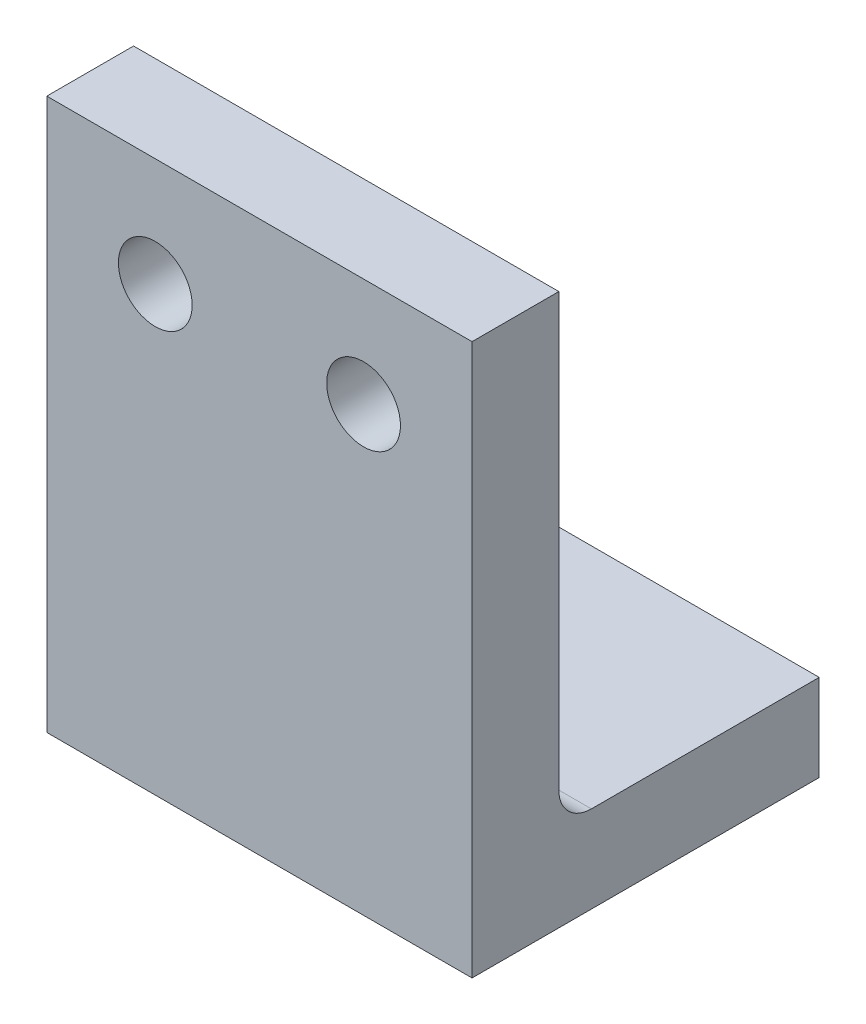
ISO-10303-21;
HEADER;
FILE_DESCRIPTION(('STEP AP214'),'2;1');
FILE_NAME('part.step','',(''),(''),'','','');
FILE_SCHEMA(('AUTOMOTIVE_DESIGN { 1 0 10303 214 1 1 1 1 }'));
ENDSEC;
DATA;
#1=APPLICATION_CONTEXT('core data for automotive mechanical design processes');
#2=APPLICATION_PROTOCOL_DEFINITION('international standard','automotive_design',2000,#1);
#3=PRODUCT_CONTEXT('',#1,'mechanical');
#4=PRODUCT('Part','Part','',(#3));
#5=PRODUCT_RELATED_PRODUCT_CATEGORY('part','',(#4));
#6=PRODUCT_DEFINITION_FORMATION('','',#4);
#7=PRODUCT_DEFINITION_CONTEXT('part definition',#1,'design');
#8=PRODUCT_DEFINITION('design','',#6,#7);
#9=PRODUCT_DEFINITION_SHAPE('','',#8);
#10=(LENGTH_UNIT() NAMED_UNIT(*) SI_UNIT(.MILLI.,.METRE.));
#11=(NAMED_UNIT(*) PLANE_ANGLE_UNIT() SI_UNIT($,.RADIAN.));
#12=(NAMED_UNIT(*) SI_UNIT($,.STERADIAN.) SOLID_ANGLE_UNIT());
#13=UNCERTAINTY_MEASURE_WITH_UNIT(LENGTH_MEASURE(1.E-05),#10,'distance_accuracy_value','');
#14=(GEOMETRIC_REPRESENTATION_CONTEXT(3) GLOBAL_UNCERTAINTY_ASSIGNED_CONTEXT((#13)) GLOBAL_UNIT_ASSIGNED_CONTEXT((#10,
#11,#12)) REPRESENTATION_CONTEXT('',''));
#15=CARTESIAN_POINT('',(0.,0.,0.));
#16=DIRECTION('',(0.,0.,1.));
#17=DIRECTION('',(1.,0.,0.));
#18=AXIS2_PLACEMENT_3D('',#15,#16,#17);
#19=CARTESIAN_POINT('',(0.,0.,4.));
#20=DIRECTION('',(0.,0.,1.));
#21=DIRECTION('',(1.,0.,0.));
#22=AXIS2_PLACEMENT_3D('',#19,#20,#21);
#23=PLANE('',#22);
#24=CARTESIAN_POINT('',(-4.8,0.,4.));
#25=DIRECTION('',(0.,0.,1.));
#26=DIRECTION('',(1.,0.,0.));
#27=AXIS2_PLACEMENT_3D('',#24,#25,#26);
#28=CIRCLE('',#27,1.7);
#29=CARTESIAN_POINT('',(-3.1,0.,4.));
#30=VERTEX_POINT('',#29);
#31=EDGE_CURVE('E128',#30,#30,#28,.T.);
#32=ORIENTED_EDGE('',*,*,#31,.F.);
#33=EDGE_LOOP('',(#32));
#34=FACE_BOUND('',#33,.T.);
#35=DIRECTION('',(0.,-1.,0.));
#36=VECTOR('',#35,1.);
#37=CARTESIAN_POINT('',(-9.8,5.,4.));
#38=LINE('',#37,#36);
#39=CARTESIAN_POINT('',(-9.8,5.,4.));
#40=VERTEX_POINT('',#39);
#41=CARTESIAN_POINT('',(-9.8,-20.4,4.));
#42=VERTEX_POINT('',#41);
#43=EDGE_CURVE('E134',#40,#42,#38,.T.);
#44=ORIENTED_EDGE('',*,*,#43,.T.);
#45=DIRECTION('',(-1.,0.,0.));
#46=VECTOR('',#45,1.);
#47=CARTESIAN_POINT('',(-9.8,-20.4,4.));
#48=LINE('',#47,#46);
#49=CARTESIAN_POINT('',(9.8,-20.4,4.));
#50=VERTEX_POINT('',#49);
#51=EDGE_CURVE('E108',#50,#42,#48,.T.);
#52=ORIENTED_EDGE('',*,*,#51,.F.);
#53=DIRECTION('',(0.,1.,0.));
#54=VECTOR('',#53,1.);
#55=CARTESIAN_POINT('',(9.8,5.,4.));
#56=LINE('',#55,#54);
#57=CARTESIAN_POINT('',(9.8,5.,4.));
#58=VERTEX_POINT('',#57);
#59=EDGE_CURVE('E136',#50,#58,#56,.T.);
#60=ORIENTED_EDGE('',*,*,#59,.T.);
#61=DIRECTION('',(-1.,0.,0.));
#62=VECTOR('',#61,1.);
#63=CARTESIAN_POINT('',(-9.8,5.,4.));
#64=LINE('',#63,#62);
#65=EDGE_CURVE('E139',#58,#40,#64,.T.);
#66=ORIENTED_EDGE('',*,*,#65,.T.);
#67=EDGE_LOOP('',(#44,#52,#60,#66));
#68=FACE_BOUND('',#67,.T.);
#69=CARTESIAN_POINT('',(4.8,0.,4.));
#70=DIRECTION('',(0.,0.,1.));
#71=DIRECTION('',(1.,0.,0.));
#72=AXIS2_PLACEMENT_3D('',#69,#70,#71);
#73=CIRCLE('',#72,1.7);
#74=CARTESIAN_POINT('',(6.5,0.,4.));
#75=VERTEX_POINT('',#74);
#76=EDGE_CURVE('E120',#75,#75,#73,.T.);
#77=ORIENTED_EDGE('',*,*,#76,.F.);
#78=EDGE_LOOP('',(#77));
#79=FACE_BOUND('',#78,.T.);
#80=ADVANCED_FACE('F33',(#34,#68,#79),#23,.T.);
#81=CARTESIAN_POINT('',(0.,0.,0.));
#82=DIRECTION('',(0.,0.,1.));
#83=DIRECTION('',(1.,0.,0.));
#84=AXIS2_PLACEMENT_3D('',#81,#82,#83);
#85=PLANE('',#84);
#86=DIRECTION('',(0.,1.,0.));
#87=VECTOR('',#86,1.);
#88=CARTESIAN_POINT('',(9.8,5.,0.));
#89=LINE('',#88,#87);
#90=CARTESIAN_POINT('',(9.8,-14.9,0.));
#91=VERTEX_POINT('',#90);
#92=CARTESIAN_POINT('',(9.8,5.,0.));
#93=VERTEX_POINT('',#92);
#94=EDGE_CURVE('E143',#91,#93,#89,.T.);
#95=ORIENTED_EDGE('',*,*,#94,.F.);
#96=DIRECTION('',(1.,0.,0.));
#97=VECTOR('',#96,1.);
#98=CARTESIAN_POINT('',(-9.8,-14.9,0.));
#99=LINE('',#98,#97);
#100=CARTESIAN_POINT('',(-9.8,-14.9,0.));
#101=VERTEX_POINT('',#100);
#102=EDGE_CURVE('E54',#91,#101,#99,.F.);
#103=ORIENTED_EDGE('',*,*,#102,.T.);
#104=DIRECTION('',(0.,-1.,0.));
#105=VECTOR('',#104,1.);
#106=CARTESIAN_POINT('',(-9.8,5.,0.));
#107=LINE('',#106,#105);
#108=CARTESIAN_POINT('',(-9.8,5.,0.));
#109=VERTEX_POINT('',#108);
#110=EDGE_CURVE('E131',#109,#101,#107,.T.);
#111=ORIENTED_EDGE('',*,*,#110,.F.);
#112=DIRECTION('',(-1.,0.,0.));
#113=VECTOR('',#112,1.);
#114=CARTESIAN_POINT('',(-9.8,5.,0.));
#115=LINE('',#114,#113);
#116=EDGE_CURVE('E137',#93,#109,#115,.T.);
#117=ORIENTED_EDGE('',*,*,#116,.F.);
#118=EDGE_LOOP('',(#95,#103,#111,#117));
#119=FACE_BOUND('',#118,.T.);
#120=CARTESIAN_POINT('',(-4.8,0.,0.));
#121=DIRECTION('',(0.,0.,1.));
#122=DIRECTION('',(1.,0.,0.));
#123=AXIS2_PLACEMENT_3D('',#120,#121,#122);
#124=CIRCLE('',#123,1.7);
#125=CARTESIAN_POINT('',(-3.1,0.,0.));
#126=VERTEX_POINT('',#125);
#127=EDGE_CURVE('E126',#126,#126,#124,.T.);
#128=ORIENTED_EDGE('',*,*,#127,.T.);
#129=EDGE_LOOP('',(#128));
#130=FACE_BOUND('',#129,.T.);
#131=CARTESIAN_POINT('',(4.8,0.,0.));
#132=DIRECTION('',(0.,0.,1.));
#133=DIRECTION('',(1.,0.,0.));
#134=AXIS2_PLACEMENT_3D('',#131,#132,#133);
#135=CIRCLE('',#134,1.7);
#136=CARTESIAN_POINT('',(6.5,0.,0.));
#137=VERTEX_POINT('',#136);
#138=EDGE_CURVE('E117',#137,#137,#135,.T.);
#139=ORIENTED_EDGE('',*,*,#138,.T.);
#140=EDGE_LOOP('',(#139));
#141=FACE_BOUND('',#140,.T.);
#142=ADVANCED_FACE('F173',(#119,#130,#141),#85,.F.);
#143=CARTESIAN_POINT('',(-9.8,5.,4.));
#144=DIRECTION('',(1.,0.,0.));
#145=DIRECTION('',(0.,1.,0.));
#146=AXIS2_PLACEMENT_3D('',#143,#144,#145);
#147=PLANE('',#146);
#148=ORIENTED_EDGE('',*,*,#110,.T.);
#149=CARTESIAN_POINT('',(-9.8,-14.9,-1.5));
#150=DIRECTION('',(1.,0.,0.));
#151=DIRECTION('',(0.,1.,0.));
#152=AXIS2_PLACEMENT_3D('',#149,#150,#151);
#153=CIRCLE('',#152,1.5);
#154=CARTESIAN_POINT('',(-9.8,-16.4,-1.5));
#155=VERTEX_POINT('',#154);
#156=EDGE_CURVE('E11',#101,#155,#153,.T.);
#157=ORIENTED_EDGE('',*,*,#156,.T.);
#158=DIRECTION('',(0.,0.,-1.));
#159=VECTOR('',#158,1.);
#160=CARTESIAN_POINT('',(-9.8,-16.4,4.));
#161=LINE('',#160,#159);
#162=CARTESIAN_POINT('',(-9.8,-16.4,-12.));
#163=VERTEX_POINT('',#162);
#164=EDGE_CURVE('E115',#155,#163,#161,.T.);
#165=ORIENTED_EDGE('',*,*,#164,.T.);
#166=DIRECTION('',(0.,1.,0.));
#167=VECTOR('',#166,1.);
#168=CARTESIAN_POINT('',(-9.8,-20.4,-12.));
#169=LINE('',#168,#167);
#170=CARTESIAN_POINT('',(-9.8,-20.4,-12.));
#171=VERTEX_POINT('',#170);
#172=EDGE_CURVE('E95',#171,#163,#169,.T.);
#173=ORIENTED_EDGE('',*,*,#172,.F.);
#174=DIRECTION('',(0.,0.,-1.));
#175=VECTOR('',#174,1.);
#176=CARTESIAN_POINT('',(-9.8,-20.4,4.));
#177=LINE('',#176,#175);
#178=EDGE_CURVE('E102',#42,#171,#177,.T.);
#179=ORIENTED_EDGE('',*,*,#178,.F.);
#180=ORIENTED_EDGE('',*,*,#43,.F.);
#181=DIRECTION('',(0.,0.,-1.));
#182=VECTOR('',#181,1.);
#183=CARTESIAN_POINT('',(-9.8,5.,4.));
#184=LINE('',#183,#182);
#185=EDGE_CURVE('E141',#40,#109,#184,.T.);
#186=ORIENTED_EDGE('',*,*,#185,.T.);
#187=EDGE_LOOP('',(#148,#157,#165,#173,#179,#180,#186));
#188=FACE_BOUND('',#187,.T.);
#189=ADVANCED_FACE('F113',(#188),#147,.F.);
#190=CARTESIAN_POINT('',(9.8,5.,4.));
#191=DIRECTION('',(-1.,0.,0.));
#192=DIRECTION('',(0.,-1.,0.));
#193=AXIS2_PLACEMENT_3D('',#190,#191,#192);
#194=PLANE('',#193);
#195=DIRECTION('',(0.,0.,1.));
#196=VECTOR('',#195,1.);
#197=CARTESIAN_POINT('',(9.8,-16.4,4.));
#198=LINE('',#197,#196);
#199=CARTESIAN_POINT('',(9.8,-16.4,-12.));
#200=VERTEX_POINT('',#199);
#201=CARTESIAN_POINT('',(9.8,-16.4,-1.5));
#202=VERTEX_POINT('',#201);
#203=EDGE_CURVE('E111',#200,#202,#198,.T.);
#204=ORIENTED_EDGE('',*,*,#203,.T.);
#205=CARTESIAN_POINT('',(9.8,-14.9,-1.5));
#206=DIRECTION('',(-1.,0.,0.));
#207=DIRECTION('',(0.,-1.,0.));
#208=AXIS2_PLACEMENT_3D('',#205,#206,#207);
#209=CIRCLE('',#208,1.5);
#210=EDGE_CURVE('E41',#202,#91,#209,.T.);
#211=ORIENTED_EDGE('',*,*,#210,.T.);
#212=ORIENTED_EDGE('',*,*,#94,.T.);
#213=DIRECTION('',(0.,0.,-1.));
#214=VECTOR('',#213,1.);
#215=CARTESIAN_POINT('',(9.8,5.,4.));
#216=LINE('',#215,#214);
#217=EDGE_CURVE('E148',#58,#93,#216,.T.);
#218=ORIENTED_EDGE('',*,*,#217,.F.);
#219=ORIENTED_EDGE('',*,*,#59,.F.);
#220=DIRECTION('',(0.,0.,1.));
#221=VECTOR('',#220,1.);
#222=CARTESIAN_POINT('',(9.8,-20.4,4.));
#223=LINE('',#222,#221);
#224=CARTESIAN_POINT('',(9.8,-20.4,-12.));
#225=VERTEX_POINT('',#224);
#226=EDGE_CURVE('E101',#225,#50,#223,.T.);
#227=ORIENTED_EDGE('',*,*,#226,.F.);
#228=DIRECTION('',(0.,1.,0.));
#229=VECTOR('',#228,1.);
#230=CARTESIAN_POINT('',(9.8,-20.4,-12.));
#231=LINE('',#230,#229);
#232=EDGE_CURVE('E97',#225,#200,#231,.T.);
#233=ORIENTED_EDGE('',*,*,#232,.T.);
#234=EDGE_LOOP('',(#204,#211,#212,#218,#219,#227,#233));
#235=FACE_BOUND('',#234,.T.);
#236=ADVANCED_FACE('F160',(#235),#194,.F.);
#237=CARTESIAN_POINT('',(-9.8,5.,4.));
#238=DIRECTION('',(0.,-1.,0.));
#239=DIRECTION('',(0.,0.,-1.));
#240=AXIS2_PLACEMENT_3D('',#237,#238,#239);
#241=PLANE('',#240);
#242=ORIENTED_EDGE('',*,*,#116,.T.);
#243=ORIENTED_EDGE('',*,*,#185,.F.);
#244=ORIENTED_EDGE('',*,*,#65,.F.);
#245=ORIENTED_EDGE('',*,*,#217,.T.);
#246=EDGE_LOOP('',(#242,#243,#244,#245));
#247=FACE_BOUND('',#246,.T.);
#248=ADVANCED_FACE('F175',(#247),#241,.F.);
#249=CARTESIAN_POINT('',(-4.8,0.,4.));
#250=DIRECTION('',(0.,0.,-1.));
#251=DIRECTION('',(-1.,0.,0.));
#252=AXIS2_PLACEMENT_3D('',#249,#250,#251);
#253=CYLINDRICAL_SURFACE('',#252,1.7);
#254=ORIENTED_EDGE('',*,*,#31,.T.);
#255=EDGE_LOOP('',(#254));
#256=FACE_BOUND('',#255,.T.);
#257=ORIENTED_EDGE('',*,*,#127,.F.);
#258=EDGE_LOOP('',(#257));
#259=FACE_BOUND('',#258,.T.);
#260=ADVANCED_FACE('F177',(#256,#259),#253,.F.);
#261=CARTESIAN_POINT('',(4.8,0.,4.));
#262=DIRECTION('',(0.,0.,-1.));
#263=DIRECTION('',(-1.,0.,0.));
#264=AXIS2_PLACEMENT_3D('',#261,#262,#263);
#265=CYLINDRICAL_SURFACE('',#264,1.7);
#266=ORIENTED_EDGE('',*,*,#76,.T.);
#267=EDGE_LOOP('',(#266));
#268=FACE_BOUND('',#267,.T.);
#269=ORIENTED_EDGE('',*,*,#138,.F.);
#270=EDGE_LOOP('',(#269));
#271=FACE_BOUND('',#270,.T.);
#272=ADVANCED_FACE('F183',(#268,#271),#265,.F.);
#273=CARTESIAN_POINT('',(0.,-16.4,0.));
#274=DIRECTION('',(0.,-1.,0.));
#275=DIRECTION('',(0.,0.,-1.));
#276=AXIS2_PLACEMENT_3D('',#273,#274,#275);
#277=PLANE('',#276);
#278=ORIENTED_EDGE('',*,*,#164,.F.);
#279=DIRECTION('',(1.,0.,0.));
#280=VECTOR('',#279,1.);
#281=CARTESIAN_POINT('',(9.8,-16.4,-1.5));
#282=LINE('',#281,#280);
#283=EDGE_CURVE('E151',#155,#202,#282,.T.);
#284=ORIENTED_EDGE('',*,*,#283,.T.);
#285=ORIENTED_EDGE('',*,*,#203,.F.);
#286=DIRECTION('',(1.,0.,0.));
#287=VECTOR('',#286,1.);
#288=CARTESIAN_POINT('',(-9.8,-16.4,-12.));
#289=LINE('',#288,#287);
#290=EDGE_CURVE('E161',#163,#200,#289,.T.);
#291=ORIENTED_EDGE('',*,*,#290,.F.);
#292=EDGE_LOOP('',(#278,#284,#285,#291));
#293=FACE_BOUND('',#292,.T.);
#294=ADVANCED_FACE('F157',(#293),#277,.F.);
#295=CARTESIAN_POINT('',(-9.8,-20.4,-12.));
#296=DIRECTION('',(0.,0.,1.));
#297=DIRECTION('',(1.,0.,0.));
#298=AXIS2_PLACEMENT_3D('',#295,#296,#297);
#299=PLANE('',#298);
#300=ORIENTED_EDGE('',*,*,#290,.T.);
#301=ORIENTED_EDGE('',*,*,#232,.F.);
#302=DIRECTION('',(1.,0.,0.));
#303=VECTOR('',#302,1.);
#304=CARTESIAN_POINT('',(-9.8,-20.4,-12.));
#305=LINE('',#304,#303);
#306=EDGE_CURVE('E91',#171,#225,#305,.T.);
#307=ORIENTED_EDGE('',*,*,#306,.F.);
#308=ORIENTED_EDGE('',*,*,#172,.T.);
#309=EDGE_LOOP('',(#300,#301,#307,#308));
#310=FACE_BOUND('',#309,.T.);
#311=ADVANCED_FACE('F93',(#310),#299,.F.);
#312=CARTESIAN_POINT('',(0.,-20.4,0.));
#313=DIRECTION('',(0.,-1.,0.));
#314=DIRECTION('',(0.,0.,-1.));
#315=AXIS2_PLACEMENT_3D('',#312,#313,#314);
#316=PLANE('',#315);
#317=ORIENTED_EDGE('',*,*,#178,.T.);
#318=ORIENTED_EDGE('',*,*,#306,.T.);
#319=ORIENTED_EDGE('',*,*,#226,.T.);
#320=ORIENTED_EDGE('',*,*,#51,.T.);
#321=EDGE_LOOP('',(#317,#318,#319,#320));
#322=FACE_BOUND('',#321,.T.);
#323=ADVANCED_FACE('F106',(#322),#316,.T.);
#324=CARTESIAN_POINT('',(0.,-14.9,-1.5));
#325=DIRECTION('',(-1.,0.,0.));
#326=DIRECTION('',(0.,0.,1.));
#327=AXIS2_PLACEMENT_3D('',#324,#325,#326);
#328=CYLINDRICAL_SURFACE('',#327,1.5);
#329=ORIENTED_EDGE('',*,*,#156,.F.);
#330=ORIENTED_EDGE('',*,*,#102,.F.);
#331=ORIENTED_EDGE('',*,*,#210,.F.);
#332=ORIENTED_EDGE('',*,*,#283,.F.);
#333=EDGE_LOOP('',(#329,#330,#331,#332));
#334=FACE_BOUND('',#333,.T.);
#335=ADVANCED_FACE('F35',(#334),#328,.F.);
#336=CLOSED_SHELL('',(#80,#142,#189,#236,#248,#260,#272,#294,#311,#323,#335));
#337=MANIFOLD_SOLID_BREP('B2',#336);
#338=ADVANCED_BREP_SHAPE_REPRESENTATION('',(#18,#337),#14);
#339=SHAPE_DEFINITION_REPRESENTATION(#9,#338);
ENDSEC;
END-ISO-10303-21;
